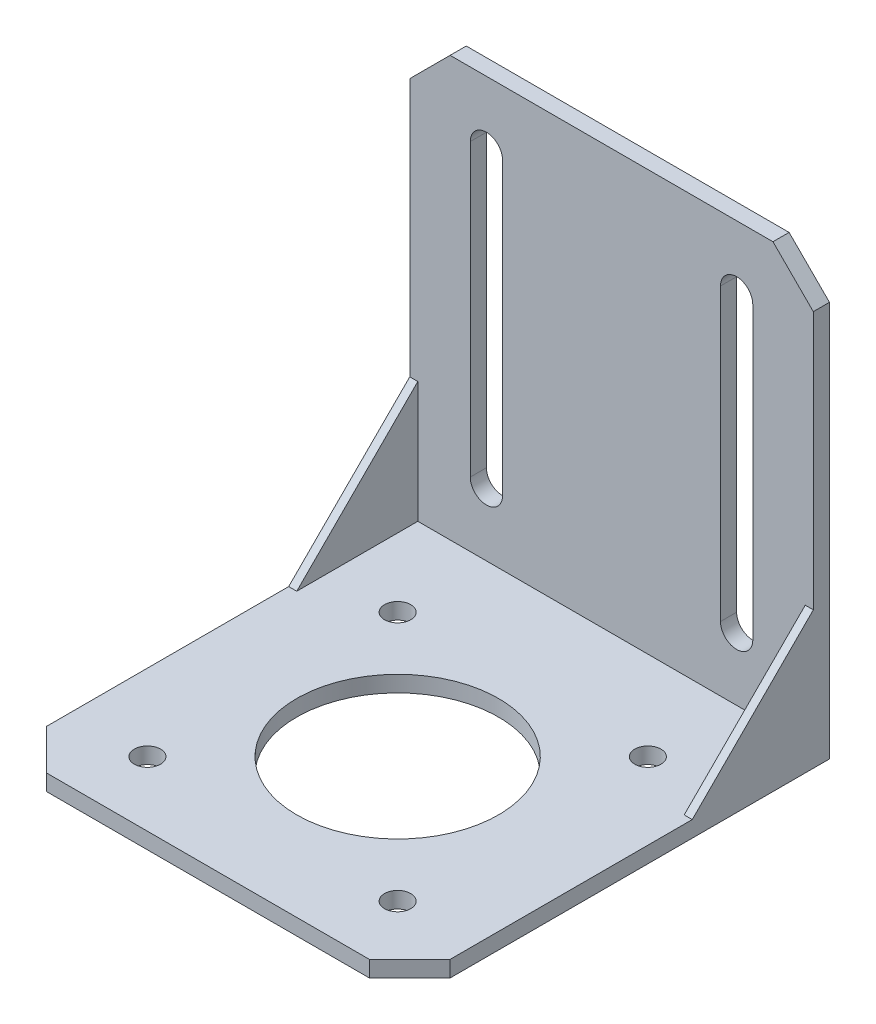
ISO-10303-21;
HEADER;
FILE_DESCRIPTION(('STEP AP214'),'2;1');
FILE_NAME('part.step','',(''),(''),'','','');
FILE_SCHEMA(('AUTOMOTIVE_DESIGN { 1 0 10303 214 1 1 1 1 }'));
ENDSEC;
DATA;
#1=APPLICATION_CONTEXT('core data for automotive mechanical design processes');
#2=APPLICATION_PROTOCOL_DEFINITION('international standard','automotive_design',2000,#1);
#3=PRODUCT_CONTEXT('',#1,'mechanical');
#4=PRODUCT('Part','Part','',(#3));
#5=PRODUCT_RELATED_PRODUCT_CATEGORY('part','',(#4));
#6=PRODUCT_DEFINITION_FORMATION('','',#4);
#7=PRODUCT_DEFINITION_CONTEXT('part definition',#1,'design');
#8=PRODUCT_DEFINITION('design','',#6,#7);
#9=PRODUCT_DEFINITION_SHAPE('','',#8);
#10=(LENGTH_UNIT() NAMED_UNIT(*) SI_UNIT(.MILLI.,.METRE.));
#11=(NAMED_UNIT(*) PLANE_ANGLE_UNIT() SI_UNIT($,.RADIAN.));
#12=(NAMED_UNIT(*) SI_UNIT($,.STERADIAN.) SOLID_ANGLE_UNIT());
#13=UNCERTAINTY_MEASURE_WITH_UNIT(LENGTH_MEASURE(1.E-05),#10,'distance_accuracy_value','');
#14=(GEOMETRIC_REPRESENTATION_CONTEXT(3) GLOBAL_UNCERTAINTY_ASSIGNED_CONTEXT((#13)) GLOBAL_UNIT_ASSIGNED_CONTEXT((#10,
#11,#12)) REPRESENTATION_CONTEXT('',''));
#15=CARTESIAN_POINT('',(0.,0.,0.));
#16=DIRECTION('',(0.,0.,1.));
#17=DIRECTION('',(1.,0.,0.));
#18=AXIS2_PLACEMENT_3D('',#15,#16,#17);
#19=CARTESIAN_POINT('',(-50.,0.,26.));
#20=DIRECTION('',(0.,0.,1.));
#21=DIRECTION('',(1.,0.,0.));
#22=AXIS2_PLACEMENT_3D('',#19,#20,#21);
#23=PLANE('',#22);
#24=DIRECTION('',(1.,0.,0.));
#25=VECTOR('',#24,1.);
#26=CARTESIAN_POINT('',(-50.,2.,26.));
#27=LINE('',#26,#25);
#28=CARTESIAN_POINT('',(-45.,2.,26.));
#29=VERTEX_POINT('',#28);
#30=CARTESIAN_POINT('',(-5.00000000000002,2.,26.));
#31=VERTEX_POINT('',#30);
#32=EDGE_CURVE('E330',#29,#31,#27,.T.);
#33=ORIENTED_EDGE('',*,*,#32,.F.);
#34=DIRECTION('',(0.,-1.,0.));
#35=VECTOR('',#34,1.);
#36=CARTESIAN_POINT('',(-45.,0.,26.));
#37=LINE('',#36,#35);
#38=CARTESIAN_POINT('',(-45.,0.,26.));
#39=VERTEX_POINT('',#38);
#40=EDGE_CURVE('E371',#29,#39,#37,.T.);
#41=ORIENTED_EDGE('',*,*,#40,.T.);
#42=DIRECTION('',(1.,0.,0.));
#43=VECTOR('',#42,1.);
#44=CARTESIAN_POINT('',(-50.,0.,26.));
#45=LINE('',#44,#43);
#46=CARTESIAN_POINT('',(-5.00000000000002,0.,26.));
#47=VERTEX_POINT('',#46);
#48=EDGE_CURVE('E322',#39,#47,#45,.T.);
#49=ORIENTED_EDGE('',*,*,#48,.T.);
#50=DIRECTION('',(0.,1.,0.));
#51=VECTOR('',#50,1.);
#52=CARTESIAN_POINT('',(-5.00000000000002,2.,26.));
#53=LINE('',#52,#51);
#54=EDGE_CURVE('E369',#47,#31,#53,.T.);
#55=ORIENTED_EDGE('',*,*,#54,.T.);
#56=EDGE_LOOP('',(#33,#41,#49,#55));
#57=FACE_BOUND('',#56,.T.);
#58=ADVANCED_FACE('F37',(#57),#23,.T.);
#59=CARTESIAN_POINT('',(-50.,2.,26.));
#60=DIRECTION('',(0.,1.,0.));
#61=DIRECTION('',(0.,0.,1.));
#62=AXIS2_PLACEMENT_3D('',#59,#60,#61);
#63=PLANE('',#62);
#64=DIRECTION('',(-1.,0.,0.));
#65=VECTOR('',#64,1.);
#66=CARTESIAN_POINT('',(-49.,2.,-9.));
#67=LINE('',#66,#65);
#68=CARTESIAN_POINT('',(-49.,2.,-9.));
#69=VERTEX_POINT('',#68);
#70=CARTESIAN_POINT('',(-50.,2.,-9.00000000000001));
#71=VERTEX_POINT('',#70);
#72=EDGE_CURVE('E210',#69,#71,#67,.T.);
#73=ORIENTED_EDGE('',*,*,#72,.T.);
#74=DIRECTION('',(0.,0.,1.));
#75=VECTOR('',#74,1.);
#76=CARTESIAN_POINT('',(-50.,2.,26.));
#77=LINE('',#76,#75);
#78=CARTESIAN_POINT('',(-50.,2.,21.));
#79=VERTEX_POINT('',#78);
#80=EDGE_CURVE('E320',#71,#79,#77,.T.);
#81=ORIENTED_EDGE('',*,*,#80,.T.);
#82=DIRECTION('',(-0.707106781186546,0.,-0.707106781186549));
#83=VECTOR('',#82,1.);
#84=CARTESIAN_POINT('',(-47.5,2.,23.5));
#85=LINE('',#84,#83);
#86=EDGE_CURVE('E11',#79,#29,#85,.F.);
#87=ORIENTED_EDGE('',*,*,#86,.T.);
#88=ORIENTED_EDGE('',*,*,#32,.T.);
#89=DIRECTION('',(0.707106781186549,0.,-0.707106781186547));
#90=VECTOR('',#89,1.);
#91=CARTESIAN_POINT('',(-27.5000000000001,2.,48.5));
#92=LINE('',#91,#90);
#93=CARTESIAN_POINT('',(0.,2.,21.));
#94=VERTEX_POINT('',#93);
#95=EDGE_CURVE('E46',#31,#94,#92,.T.);
#96=ORIENTED_EDGE('',*,*,#95,.T.);
#97=DIRECTION('',(0.,0.,1.));
#98=VECTOR('',#97,1.);
#99=CARTESIAN_POINT('',(0.,2.,26.));
#100=LINE('',#99,#98);
#101=CARTESIAN_POINT('',(0.,2.,-9.00000000000001));
#102=VERTEX_POINT('',#101);
#103=EDGE_CURVE('E315',#102,#94,#100,.T.);
#104=ORIENTED_EDGE('',*,*,#103,.F.);
#105=DIRECTION('',(1.,0.,0.));
#106=VECTOR('',#105,1.);
#107=CARTESIAN_POINT('',(-1.,2.,-9.));
#108=LINE('',#107,#106);
#109=CARTESIAN_POINT('',(-1.,2.,-9.));
#110=VERTEX_POINT('',#109);
#111=EDGE_CURVE('E196',#110,#102,#108,.T.);
#112=ORIENTED_EDGE('',*,*,#111,.F.);
#113=DIRECTION('',(0.,0.,-1.));
#114=VECTOR('',#113,1.);
#115=CARTESIAN_POINT('',(-1.,2.,-9.));
#116=LINE('',#115,#114);
#117=CARTESIAN_POINT('',(-1.,2.,-24.));
#118=VERTEX_POINT('',#117);
#119=EDGE_CURVE('E197',#110,#118,#116,.T.);
#120=ORIENTED_EDGE('',*,*,#119,.T.);
#121=DIRECTION('',(1.,0.,0.));
#122=VECTOR('',#121,1.);
#123=CARTESIAN_POINT('',(-50.,2.,-24.));
#124=LINE('',#123,#122);
#125=CARTESIAN_POINT('',(-49.,2.,-24.));
#126=VERTEX_POINT('',#125);
#127=EDGE_CURVE('E208',#126,#118,#124,.T.);
#128=ORIENTED_EDGE('',*,*,#127,.F.);
#129=DIRECTION('',(0.,0.,1.));
#130=VECTOR('',#129,1.);
#131=CARTESIAN_POINT('',(-49.,2.,0.));
#132=LINE('',#131,#130);
#133=EDGE_CURVE('E53',#126,#69,#132,.T.);
#134=ORIENTED_EDGE('',*,*,#133,.T.);
#135=EDGE_LOOP('',(#73,#81,#87,#88,#96,#104,#112,#120,#128,#134));
#136=FACE_BOUND('',#135,.T.);
#137=CARTESIAN_POINT('',(-25.,2.,2.5));
#138=DIRECTION('',(0.,1.,0.));
#139=DIRECTION('',(0.,0.,1.));
#140=AXIS2_PLACEMENT_3D('',#137,#138,#139);
#141=CIRCLE('',#140,12.5);
#142=CARTESIAN_POINT('',(-25.,2.,15.));
#143=VERTEX_POINT('',#142);
#144=EDGE_CURVE('E245',#143,#143,#141,.T.);
#145=ORIENTED_EDGE('',*,*,#144,.F.);
#146=EDGE_LOOP('',(#145));
#147=FACE_BOUND('',#146,.T.);
#148=CARTESIAN_POINT('',(-40.5,2.,18.));
#149=DIRECTION('',(0.,1.,0.));
#150=DIRECTION('',(0.,0.,-1.));
#151=AXIS2_PLACEMENT_3D('',#148,#149,#150);
#152=CIRCLE('',#151,1.625);
#153=CARTESIAN_POINT('',(-40.5,2.,16.375));
#154=VERTEX_POINT('',#153);
#155=EDGE_CURVE('E298',#154,#154,#152,.T.);
#156=ORIENTED_EDGE('',*,*,#155,.F.);
#157=EDGE_LOOP('',(#156));
#158=FACE_BOUND('',#157,.T.);
#159=CARTESIAN_POINT('',(-9.50000000000001,2.,18.));
#160=DIRECTION('',(0.,1.,0.));
#161=DIRECTION('',(0.,0.,1.));
#162=AXIS2_PLACEMENT_3D('',#159,#160,#161);
#163=CIRCLE('',#162,1.62500000000001);
#164=CARTESIAN_POINT('',(-9.50000000000001,2.,19.625));
#165=VERTEX_POINT('',#164);
#166=EDGE_CURVE('E292',#165,#165,#163,.T.);
#167=ORIENTED_EDGE('',*,*,#166,.F.);
#168=EDGE_LOOP('',(#167));
#169=FACE_BOUND('',#168,.T.);
#170=CARTESIAN_POINT('',(-9.50000000000001,2.,-13.));
#171=DIRECTION('',(0.,1.,0.));
#172=DIRECTION('',(0.,0.,-1.));
#173=AXIS2_PLACEMENT_3D('',#170,#171,#172);
#174=CIRCLE('',#173,1.62500000000001);
#175=CARTESIAN_POINT('',(-9.50000000000001,2.,-14.625));
#176=VERTEX_POINT('',#175);
#177=EDGE_CURVE('E286',#176,#176,#174,.T.);
#178=ORIENTED_EDGE('',*,*,#177,.F.);
#179=EDGE_LOOP('',(#178));
#180=FACE_BOUND('',#179,.T.);
#181=CARTESIAN_POINT('',(-40.5,2.,-13.));
#182=DIRECTION('',(0.,1.,0.));
#183=DIRECTION('',(0.,0.,1.));
#184=AXIS2_PLACEMENT_3D('',#181,#182,#183);
#185=CIRCLE('',#184,1.625);
#186=CARTESIAN_POINT('',(-40.5,2.,-11.375));
#187=VERTEX_POINT('',#186);
#188=EDGE_CURVE('E285',#187,#187,#185,.T.);
#189=ORIENTED_EDGE('',*,*,#188,.F.);
#190=EDGE_LOOP('',(#189));
#191=FACE_BOUND('',#190,.T.);
#192=ADVANCED_FACE('F381',(#136,#147,#158,#169,#180,#191),#63,.T.);
#193=CARTESIAN_POINT('',(-50.,2.,-24.));
#194=DIRECTION('',(0.,0.,1.));
#195=DIRECTION('',(1.,0.,0.));
#196=AXIS2_PLACEMENT_3D('',#193,#194,#195);
#197=PLANE('',#196);
#198=DIRECTION('',(-1.,0.,0.));
#199=VECTOR('',#198,1.);
#200=CARTESIAN_POINT('',(-49.,17.,-24.));
#201=LINE('',#200,#199);
#202=CARTESIAN_POINT('',(-49.,17.,-24.));
#203=VERTEX_POINT('',#202);
#204=CARTESIAN_POINT('',(-50.,17.,-24.));
#205=VERTEX_POINT('',#204);
#206=EDGE_CURVE('E61',#203,#205,#201,.T.);
#207=ORIENTED_EDGE('',*,*,#206,.F.);
#208=DIRECTION('',(0.,-1.,0.));
#209=VECTOR('',#208,1.);
#210=CARTESIAN_POINT('',(-49.,0.,-24.));
#211=LINE('',#210,#209);
#212=EDGE_CURVE('E423',#203,#126,#211,.T.);
#213=ORIENTED_EDGE('',*,*,#212,.T.);
#214=ORIENTED_EDGE('',*,*,#127,.T.);
#215=DIRECTION('',(0.,1.,0.));
#216=VECTOR('',#215,1.);
#217=CARTESIAN_POINT('',(-1.,2.,-24.));
#218=LINE('',#217,#216);
#219=CARTESIAN_POINT('',(-1.,17.,-24.));
#220=VERTEX_POINT('',#219);
#221=EDGE_CURVE('E202',#118,#220,#218,.T.);
#222=ORIENTED_EDGE('',*,*,#221,.T.);
#223=DIRECTION('',(1.,0.,0.));
#224=VECTOR('',#223,1.);
#225=CARTESIAN_POINT('',(-1.,17.,-24.));
#226=LINE('',#225,#224);
#227=CARTESIAN_POINT('',(0.,17.,-24.));
#228=VERTEX_POINT('',#227);
#229=EDGE_CURVE('E186',#220,#228,#226,.T.);
#230=ORIENTED_EDGE('',*,*,#229,.T.);
#231=DIRECTION('',(0.,-1.,0.));
#232=VECTOR('',#231,1.);
#233=CARTESIAN_POINT('',(0.,2.,-24.));
#234=LINE('',#233,#232);
#235=CARTESIAN_POINT('',(0.,49.,-24.));
#236=VERTEX_POINT('',#235);
#237=EDGE_CURVE('E327',#236,#228,#234,.T.);
#238=ORIENTED_EDGE('',*,*,#237,.F.);
#239=DIRECTION('',(-0.707106781186549,0.707106781186545,0.));
#240=VECTOR('',#239,1.);
#241=CARTESIAN_POINT('',(-1.50000000000014,50.5000000000001,-24.));
#242=LINE('',#241,#240);
#243=CARTESIAN_POINT('',(-5.00000000000002,54.,-24.));
#244=VERTEX_POINT('',#243);
#245=EDGE_CURVE('E350',#236,#244,#242,.T.);
#246=ORIENTED_EDGE('',*,*,#245,.T.);
#247=DIRECTION('',(1.,0.,0.));
#248=VECTOR('',#247,1.);
#249=CARTESIAN_POINT('',(-50.,54.,-24.));
#250=LINE('',#249,#248);
#251=CARTESIAN_POINT('',(-45.,54.,-24.));
#252=VERTEX_POINT('',#251);
#253=EDGE_CURVE('E335',#252,#244,#250,.T.);
#254=ORIENTED_EDGE('',*,*,#253,.F.);
#255=DIRECTION('',(0.707106781186546,0.70710678118655,0.));
#256=VECTOR('',#255,1.);
#257=CARTESIAN_POINT('',(-73.5,25.4999999999999,-24.));
#258=LINE('',#257,#256);
#259=CARTESIAN_POINT('',(-50.,49.,-24.));
#260=VERTEX_POINT('',#259);
#261=EDGE_CURVE('E352',#252,#260,#258,.F.);
#262=ORIENTED_EDGE('',*,*,#261,.T.);
#263=DIRECTION('',(0.,-1.,0.));
#264=VECTOR('',#263,1.);
#265=CARTESIAN_POINT('',(-50.,2.,-24.));
#266=LINE('',#265,#264);
#267=EDGE_CURVE('E318',#260,#205,#266,.T.);
#268=ORIENTED_EDGE('',*,*,#267,.T.);
#269=EDGE_LOOP('',(#207,#213,#214,#222,#230,#238,#246,#254,#262,#268));
#270=FACE_BOUND('',#269,.T.);
#271=CARTESIAN_POINT('',(-40.5,46.,-24.));
#272=DIRECTION('',(0.,0.,1.));
#273=DIRECTION('',(1.,0.,0.));
#274=AXIS2_PLACEMENT_3D('',#271,#272,#273);
#275=CIRCLE('',#274,2.00000000000001);
#276=CARTESIAN_POINT('',(-38.5,46.,-24.));
#277=VERTEX_POINT('',#276);
#278=CARTESIAN_POINT('',(-42.5,46.,-24.));
#279=VERTEX_POINT('',#278);
#280=EDGE_CURVE('E232',#277,#279,#275,.T.);
#281=ORIENTED_EDGE('',*,*,#280,.F.);
#282=DIRECTION('',(0.,1.,0.));
#283=VECTOR('',#282,1.);
#284=CARTESIAN_POINT('',(-38.5,46.,-24.));
#285=LINE('',#284,#283);
#286=CARTESIAN_POINT('',(-38.5,10.,-24.));
#287=VERTEX_POINT('',#286);
#288=EDGE_CURVE('E222',#287,#277,#285,.T.);
#289=ORIENTED_EDGE('',*,*,#288,.F.);
#290=CARTESIAN_POINT('',(-40.5,10.,-24.));
#291=DIRECTION('',(0.,0.,1.));
#292=DIRECTION('',(1.,0.,0.));
#293=AXIS2_PLACEMENT_3D('',#290,#291,#292);
#294=CIRCLE('',#293,2.00000000000001);
#295=CARTESIAN_POINT('',(-42.5,10.,-24.));
#296=VERTEX_POINT('',#295);
#297=EDGE_CURVE('E238',#296,#287,#294,.T.);
#298=ORIENTED_EDGE('',*,*,#297,.F.);
#299=DIRECTION('',(0.,-1.,0.));
#300=VECTOR('',#299,1.);
#301=CARTESIAN_POINT('',(-42.5,46.,-24.));
#302=LINE('',#301,#300);
#303=EDGE_CURVE('E234',#279,#296,#302,.T.);
#304=ORIENTED_EDGE('',*,*,#303,.F.);
#305=EDGE_LOOP('',(#281,#289,#298,#304));
#306=FACE_BOUND('',#305,.T.);
#307=CARTESIAN_POINT('',(-9.5,46.,-24.));
#308=DIRECTION('',(0.,0.,1.));
#309=DIRECTION('',(-1.,0.,0.));
#310=AXIS2_PLACEMENT_3D('',#307,#308,#309);
#311=CIRCLE('',#310,2.);
#312=CARTESIAN_POINT('',(-7.5,46.,-24.));
#313=VERTEX_POINT('',#312);
#314=CARTESIAN_POINT('',(-11.5,46.,-24.));
#315=VERTEX_POINT('',#314);
#316=EDGE_CURVE('E216',#313,#315,#311,.T.);
#317=ORIENTED_EDGE('',*,*,#316,.F.);
#318=DIRECTION('',(0.,1.,0.));
#319=VECTOR('',#318,1.);
#320=CARTESIAN_POINT('',(-7.5,46.,-24.));
#321=LINE('',#320,#319);
#322=CARTESIAN_POINT('',(-7.5,10.,-24.));
#323=VERTEX_POINT('',#322);
#324=EDGE_CURVE('E256',#323,#313,#321,.T.);
#325=ORIENTED_EDGE('',*,*,#324,.F.);
#326=CARTESIAN_POINT('',(-9.50000000000001,10.,-24.));
#327=DIRECTION('',(0.,0.,1.));
#328=DIRECTION('',(-1.,0.,0.));
#329=AXIS2_PLACEMENT_3D('',#326,#327,#328);
#330=CIRCLE('',#329,2.00000000000001);
#331=CARTESIAN_POINT('',(-11.5,10.,-24.));
#332=VERTEX_POINT('',#331);
#333=EDGE_CURVE('E270',#332,#323,#330,.T.);
#334=ORIENTED_EDGE('',*,*,#333,.F.);
#335=DIRECTION('',(0.,-1.,0.));
#336=VECTOR('',#335,1.);
#337=CARTESIAN_POINT('',(-11.5,46.,-24.));
#338=LINE('',#337,#336);
#339=EDGE_CURVE('E267',#315,#332,#338,.T.);
#340=ORIENTED_EDGE('',*,*,#339,.F.);
#341=EDGE_LOOP('',(#317,#325,#334,#340));
#342=FACE_BOUND('',#341,.T.);
#343=ADVANCED_FACE('F206',(#270,#306,#342),#197,.T.);
#344=CARTESIAN_POINT('',(-50.,54.,-26.));
#345=DIRECTION('',(0.,1.,0.));
#346=DIRECTION('',(0.,0.,1.));
#347=AXIS2_PLACEMENT_3D('',#344,#345,#346);
#348=PLANE('',#347);
#349=DIRECTION('',(1.,0.,0.));
#350=VECTOR('',#349,1.);
#351=CARTESIAN_POINT('',(-50.,54.,-26.));
#352=LINE('',#351,#350);
#353=CARTESIAN_POINT('',(-45.,54.,-26.));
#354=VERTEX_POINT('',#353);
#355=CARTESIAN_POINT('',(-5.00000000000002,54.,-26.));
#356=VERTEX_POINT('',#355);
#357=EDGE_CURVE('E338',#354,#356,#352,.T.);
#358=ORIENTED_EDGE('',*,*,#357,.F.);
#359=DIRECTION('',(0.,0.,1.));
#360=VECTOR('',#359,1.);
#361=CARTESIAN_POINT('',(-45.,54.,-26.));
#362=LINE('',#361,#360);
#363=EDGE_CURVE('E347',#354,#252,#362,.T.);
#364=ORIENTED_EDGE('',*,*,#363,.T.);
#365=ORIENTED_EDGE('',*,*,#253,.T.);
#366=DIRECTION('',(0.,0.,-1.));
#367=VECTOR('',#366,1.);
#368=CARTESIAN_POINT('',(-5.00000000000002,54.,-26.));
#369=LINE('',#368,#367);
#370=EDGE_CURVE('E333',#244,#356,#369,.T.);
#371=ORIENTED_EDGE('',*,*,#370,.T.);
#372=EDGE_LOOP('',(#358,#364,#365,#371));
#373=FACE_BOUND('',#372,.T.);
#374=ADVANCED_FACE('F406',(#373),#348,.T.);
#375=CARTESIAN_POINT('',(-50.,0.,-26.));
#376=DIRECTION('',(0.,0.,-1.));
#377=DIRECTION('',(0.,1.,0.));
#378=AXIS2_PLACEMENT_3D('',#375,#376,#377);
#379=PLANE('',#378);
#380=CARTESIAN_POINT('',(-40.5,46.,-26.));
#381=DIRECTION('',(0.,0.,1.));
#382=DIRECTION('',(1.,0.,0.));
#383=AXIS2_PLACEMENT_3D('',#380,#381,#382);
#384=CIRCLE('',#383,2.00000000000001);
#385=CARTESIAN_POINT('',(-38.5,46.,-26.));
#386=VERTEX_POINT('',#385);
#387=CARTESIAN_POINT('',(-42.5,46.,-26.));
#388=VERTEX_POINT('',#387);
#389=EDGE_CURVE('E218',#386,#388,#384,.T.);
#390=ORIENTED_EDGE('',*,*,#389,.T.);
#391=DIRECTION('',(0.,-1.,0.));
#392=VECTOR('',#391,1.);
#393=CARTESIAN_POINT('',(-42.5,46.,-26.));
#394=LINE('',#393,#392);
#395=CARTESIAN_POINT('',(-42.5,10.,-26.));
#396=VERTEX_POINT('',#395);
#397=EDGE_CURVE('E221',#388,#396,#394,.T.);
#398=ORIENTED_EDGE('',*,*,#397,.T.);
#399=CARTESIAN_POINT('',(-40.5,10.,-26.));
#400=DIRECTION('',(0.,0.,1.));
#401=DIRECTION('',(1.,0.,0.));
#402=AXIS2_PLACEMENT_3D('',#399,#400,#401);
#403=CIRCLE('',#402,2.00000000000001);
#404=CARTESIAN_POINT('',(-38.5,10.,-26.));
#405=VERTEX_POINT('',#404);
#406=EDGE_CURVE('E225',#396,#405,#403,.T.);
#407=ORIENTED_EDGE('',*,*,#406,.T.);
#408=DIRECTION('',(0.,1.,0.));
#409=VECTOR('',#408,1.);
#410=CARTESIAN_POINT('',(-38.5,46.,-26.));
#411=LINE('',#410,#409);
#412=EDGE_CURVE('E228',#405,#386,#411,.T.);
#413=ORIENTED_EDGE('',*,*,#412,.T.);
#414=EDGE_LOOP('',(#390,#398,#407,#413));
#415=FACE_BOUND('',#414,.T.);
#416=CARTESIAN_POINT('',(-9.5,46.,-26.));
#417=DIRECTION('',(0.,0.,1.));
#418=DIRECTION('',(-1.,0.,0.));
#419=AXIS2_PLACEMENT_3D('',#416,#417,#418);
#420=CIRCLE('',#419,2.);
#421=CARTESIAN_POINT('',(-7.5,46.,-26.));
#422=VERTEX_POINT('',#421);
#423=CARTESIAN_POINT('',(-11.5,46.,-26.));
#424=VERTEX_POINT('',#423);
#425=EDGE_CURVE('E252',#422,#424,#420,.T.);
#426=ORIENTED_EDGE('',*,*,#425,.T.);
#427=DIRECTION('',(0.,-1.,0.));
#428=VECTOR('',#427,1.);
#429=CARTESIAN_POINT('',(-11.5,46.,-26.));
#430=LINE('',#429,#428);
#431=CARTESIAN_POINT('',(-11.5,10.,-26.));
#432=VERTEX_POINT('',#431);
#433=EDGE_CURVE('E255',#424,#432,#430,.T.);
#434=ORIENTED_EDGE('',*,*,#433,.T.);
#435=CARTESIAN_POINT('',(-9.50000000000001,10.,-26.));
#436=DIRECTION('',(0.,0.,1.));
#437=DIRECTION('',(-1.,0.,0.));
#438=AXIS2_PLACEMENT_3D('',#435,#436,#437);
#439=CIRCLE('',#438,2.00000000000001);
#440=CARTESIAN_POINT('',(-7.5,10.,-26.));
#441=VERTEX_POINT('',#440);
#442=EDGE_CURVE('E259',#432,#441,#439,.T.);
#443=ORIENTED_EDGE('',*,*,#442,.T.);
#444=DIRECTION('',(0.,1.,0.));
#445=VECTOR('',#444,1.);
#446=CARTESIAN_POINT('',(-7.5,46.,-26.));
#447=LINE('',#446,#445);
#448=EDGE_CURVE('E262',#441,#422,#447,.T.);
#449=ORIENTED_EDGE('',*,*,#448,.T.);
#450=EDGE_LOOP('',(#426,#434,#443,#449));
#451=FACE_BOUND('',#450,.T.);
#452=DIRECTION('',(0.,1.,0.));
#453=VECTOR('',#452,1.);
#454=CARTESIAN_POINT('',(-50.,0.,-26.));
#455=LINE('',#454,#453);
#456=CARTESIAN_POINT('',(-50.,0.,-26.));
#457=VERTEX_POINT('',#456);
#458=CARTESIAN_POINT('',(-50.,49.,-26.));
#459=VERTEX_POINT('',#458);
#460=EDGE_CURVE('E314',#457,#459,#455,.T.);
#461=ORIENTED_EDGE('',*,*,#460,.T.);
#462=DIRECTION('',(-0.707106781186546,-0.707106781186549,0.));
#463=VECTOR('',#462,1.);
#464=CARTESIAN_POINT('',(-74.5,24.4999999999998,-26.));
#465=LINE('',#464,#463);
#466=EDGE_CURVE('E361',#459,#354,#465,.F.);
#467=ORIENTED_EDGE('',*,*,#466,.T.);
#468=ORIENTED_EDGE('',*,*,#357,.T.);
#469=DIRECTION('',(0.70710678118655,-0.707106781186546,0.));
#470=VECTOR('',#469,1.);
#471=CARTESIAN_POINT('',(-0.500000000000139,49.5000000000001,-26.));
#472=LINE('',#471,#470);
#473=CARTESIAN_POINT('',(0.,49.,-26.));
#474=VERTEX_POINT('',#473);
#475=EDGE_CURVE('E359',#356,#474,#472,.T.);
#476=ORIENTED_EDGE('',*,*,#475,.T.);
#477=DIRECTION('',(0.,1.,0.));
#478=VECTOR('',#477,1.);
#479=CARTESIAN_POINT('',(0.,0.,-26.));
#480=LINE('',#479,#478);
#481=CARTESIAN_POINT('',(0.,0.,-26.));
#482=VERTEX_POINT('',#481);
#483=EDGE_CURVE('E324',#482,#474,#480,.T.);
#484=ORIENTED_EDGE('',*,*,#483,.F.);
#485=DIRECTION('',(1.,0.,0.));
#486=VECTOR('',#485,1.);
#487=CARTESIAN_POINT('',(-50.,0.,-26.));
#488=LINE('',#487,#486);
#489=EDGE_CURVE('E341',#457,#482,#488,.T.);
#490=ORIENTED_EDGE('',*,*,#489,.F.);
#491=EDGE_LOOP('',(#461,#467,#468,#476,#484,#490));
#492=FACE_BOUND('',#491,.T.);
#493=ADVANCED_FACE('F397',(#415,#451,#492),#379,.T.);
#494=CARTESIAN_POINT('',(-50.,0.,26.));
#495=DIRECTION('',(0.,-1.,0.));
#496=DIRECTION('',(0.,0.,-1.));
#497=AXIS2_PLACEMENT_3D('',#494,#495,#496);
#498=PLANE('',#497);
#499=CARTESIAN_POINT('',(-25.,0.,2.5));
#500=DIRECTION('',(0.,1.,0.));
#501=DIRECTION('',(0.,0.,1.));
#502=AXIS2_PLACEMENT_3D('',#499,#500,#501);
#503=CIRCLE('',#502,12.5);
#504=CARTESIAN_POINT('',(-25.,0.,15.));
#505=VERTEX_POINT('',#504);
#506=EDGE_CURVE('E301',#505,#505,#503,.T.);
#507=ORIENTED_EDGE('',*,*,#506,.T.);
#508=EDGE_LOOP('',(#507));
#509=FACE_BOUND('',#508,.T.);
#510=CARTESIAN_POINT('',(-40.5,0.,18.));
#511=DIRECTION('',(0.,1.,0.));
#512=DIRECTION('',(0.,0.,-1.));
#513=AXIS2_PLACEMENT_3D('',#510,#511,#512);
#514=CIRCLE('',#513,1.625);
#515=CARTESIAN_POINT('',(-40.5,0.,16.375));
#516=VERTEX_POINT('',#515);
#517=EDGE_CURVE('E295',#516,#516,#514,.T.);
#518=ORIENTED_EDGE('',*,*,#517,.T.);
#519=EDGE_LOOP('',(#518));
#520=FACE_BOUND('',#519,.T.);
#521=CARTESIAN_POINT('',(-9.50000000000001,0.,18.));
#522=DIRECTION('',(0.,1.,0.));
#523=DIRECTION('',(0.,0.,1.));
#524=AXIS2_PLACEMENT_3D('',#521,#522,#523);
#525=CIRCLE('',#524,1.62500000000001);
#526=CARTESIAN_POINT('',(-9.50000000000001,0.,19.625));
#527=VERTEX_POINT('',#526);
#528=EDGE_CURVE('E289',#527,#527,#525,.T.);
#529=ORIENTED_EDGE('',*,*,#528,.T.);
#530=EDGE_LOOP('',(#529));
#531=FACE_BOUND('',#530,.T.);
#532=CARTESIAN_POINT('',(-9.50000000000001,0.,-13.));
#533=DIRECTION('',(0.,1.,0.));
#534=DIRECTION('',(0.,0.,-1.));
#535=AXIS2_PLACEMENT_3D('',#532,#533,#534);
#536=CIRCLE('',#535,1.62500000000001);
#537=CARTESIAN_POINT('',(-9.50000000000001,0.,-14.625));
#538=VERTEX_POINT('',#537);
#539=EDGE_CURVE('E282',#538,#538,#536,.T.);
#540=ORIENTED_EDGE('',*,*,#539,.T.);
#541=EDGE_LOOP('',(#540));
#542=FACE_BOUND('',#541,.T.);
#543=CARTESIAN_POINT('',(-40.5,0.,-13.));
#544=DIRECTION('',(0.,1.,0.));
#545=DIRECTION('',(0.,0.,1.));
#546=AXIS2_PLACEMENT_3D('',#543,#544,#545);
#547=CIRCLE('',#546,1.625);
#548=CARTESIAN_POINT('',(-40.5,0.,-11.375));
#549=VERTEX_POINT('',#548);
#550=EDGE_CURVE('E306',#549,#549,#547,.T.);
#551=ORIENTED_EDGE('',*,*,#550,.T.);
#552=EDGE_LOOP('',(#551));
#553=FACE_BOUND('',#552,.T.);
#554=ORIENTED_EDGE('',*,*,#48,.F.);
#555=DIRECTION('',(0.707106781186546,0.,0.70710678118655));
#556=VECTOR('',#555,1.);
#557=CARTESIAN_POINT('',(-47.5,0.,23.5));
#558=LINE('',#557,#556);
#559=CARTESIAN_POINT('',(-50.,0.,21.));
#560=VERTEX_POINT('',#559);
#561=EDGE_CURVE('E376',#39,#560,#558,.F.);
#562=ORIENTED_EDGE('',*,*,#561,.T.);
#563=DIRECTION('',(0.,0.,-1.));
#564=VECTOR('',#563,1.);
#565=CARTESIAN_POINT('',(-50.,0.,26.));
#566=LINE('',#565,#564);
#567=EDGE_CURVE('E312',#560,#457,#566,.T.);
#568=ORIENTED_EDGE('',*,*,#567,.T.);
#569=ORIENTED_EDGE('',*,*,#489,.T.);
#570=DIRECTION('',(0.,0.,-1.));
#571=VECTOR('',#570,1.);
#572=CARTESIAN_POINT('',(0.,0.,26.));
#573=LINE('',#572,#571);
#574=CARTESIAN_POINT('',(0.,0.,21.));
#575=VERTEX_POINT('',#574);
#576=EDGE_CURVE('E309',#575,#482,#573,.T.);
#577=ORIENTED_EDGE('',*,*,#576,.F.);
#578=DIRECTION('',(-0.707106781186549,0.,0.707106781186547));
#579=VECTOR('',#578,1.);
#580=CARTESIAN_POINT('',(-27.5000000000001,0.,48.5));
#581=LINE('',#580,#579);
#582=EDGE_CURVE('E374',#575,#47,#581,.T.);
#583=ORIENTED_EDGE('',*,*,#582,.T.);
#584=EDGE_LOOP('',(#554,#562,#568,#569,#577,#583));
#585=FACE_BOUND('',#584,.T.);
#586=ADVANCED_FACE('F391',(#509,#520,#531,#542,#553,#585),#498,.T.);
#587=CARTESIAN_POINT('',(-50.,0.,0.));
#588=DIRECTION('',(-1.,0.,0.));
#589=DIRECTION('',(0.,0.,1.));
#590=AXIS2_PLACEMENT_3D('',#587,#588,#589);
#591=PLANE('',#590);
#592=ORIENTED_EDGE('',*,*,#80,.F.);
#593=DIRECTION('',(0.,0.707106781186548,-0.707106781186547));
#594=VECTOR('',#593,1.);
#595=CARTESIAN_POINT('',(-50.,-3.5,-3.5));
#596=LINE('',#595,#594);
#597=EDGE_CURVE('E418',#71,#205,#596,.T.);
#598=ORIENTED_EDGE('',*,*,#597,.T.);
#599=ORIENTED_EDGE('',*,*,#267,.F.);
#600=DIRECTION('',(0.,0.,-1.));
#601=VECTOR('',#600,1.);
#602=CARTESIAN_POINT('',(-50.,49.,0.));
#603=LINE('',#602,#601);
#604=EDGE_CURVE('E357',#260,#459,#603,.T.);
#605=ORIENTED_EDGE('',*,*,#604,.T.);
#606=ORIENTED_EDGE('',*,*,#460,.F.);
#607=ORIENTED_EDGE('',*,*,#567,.F.);
#608=DIRECTION('',(0.,1.,0.));
#609=VECTOR('',#608,1.);
#610=CARTESIAN_POINT('',(-50.,0.,21.));
#611=LINE('',#610,#609);
#612=EDGE_CURVE('E354',#560,#79,#611,.T.);
#613=ORIENTED_EDGE('',*,*,#612,.T.);
#614=EDGE_LOOP('',(#592,#598,#599,#605,#606,#607,#613));
#615=FACE_BOUND('',#614,.T.);
#616=ADVANCED_FACE('F416',(#615),#591,.T.);
#617=CARTESIAN_POINT('',(0.,0.,0.));
#618=DIRECTION('',(-1.,0.,0.));
#619=DIRECTION('',(0.,0.,1.));
#620=AXIS2_PLACEMENT_3D('',#617,#618,#619);
#621=PLANE('',#620);
#622=ORIENTED_EDGE('',*,*,#237,.T.);
#623=DIRECTION('',(0.,-0.707106781186548,0.707106781186547));
#624=VECTOR('',#623,1.);
#625=CARTESIAN_POINT('',(0.,17.,-24.));
#626=LINE('',#625,#624);
#627=EDGE_CURVE('E192',#228,#102,#626,.T.);
#628=ORIENTED_EDGE('',*,*,#627,.T.);
#629=ORIENTED_EDGE('',*,*,#103,.T.);
#630=DIRECTION('',(0.,-1.,0.));
#631=VECTOR('',#630,1.);
#632=CARTESIAN_POINT('',(0.,0.,21.));
#633=LINE('',#632,#631);
#634=EDGE_CURVE('E363',#94,#575,#633,.T.);
#635=ORIENTED_EDGE('',*,*,#634,.T.);
#636=ORIENTED_EDGE('',*,*,#576,.T.);
#637=ORIENTED_EDGE('',*,*,#483,.T.);
#638=DIRECTION('',(0.,0.,1.));
#639=VECTOR('',#638,1.);
#640=CARTESIAN_POINT('',(0.,49.,-24.));
#641=LINE('',#640,#639);
#642=EDGE_CURVE('E366',#474,#236,#641,.T.);
#643=ORIENTED_EDGE('',*,*,#642,.T.);
#644=EDGE_LOOP('',(#622,#628,#629,#635,#636,#637,#643));
#645=FACE_BOUND('',#644,.T.);
#646=ADVANCED_FACE('F388',(#645),#621,.F.);
#647=CARTESIAN_POINT('',(-45.,54.,-26.));
#648=DIRECTION('',(0.707106781186549,-0.707106781186545,0.));
#649=DIRECTION('',(0.,0.,1.));
#650=AXIS2_PLACEMENT_3D('',#647,#648,#649);
#651=PLANE('',#650);
#652=ORIENTED_EDGE('',*,*,#466,.F.);
#653=ORIENTED_EDGE('',*,*,#604,.F.);
#654=ORIENTED_EDGE('',*,*,#261,.F.);
#655=ORIENTED_EDGE('',*,*,#363,.F.);
#656=EDGE_LOOP('',(#652,#653,#654,#655));
#657=FACE_BOUND('',#656,.T.);
#658=ADVANCED_FACE('F410',(#657),#651,.F.);
#659=CARTESIAN_POINT('',(0.,49.,0.));
#660=DIRECTION('',(0.707106781186545,0.707106781186549,0.));
#661=DIRECTION('',(0.,0.,-1.));
#662=AXIS2_PLACEMENT_3D('',#659,#660,#661);
#663=PLANE('',#662);
#664=ORIENTED_EDGE('',*,*,#475,.F.);
#665=ORIENTED_EDGE('',*,*,#370,.F.);
#666=ORIENTED_EDGE('',*,*,#245,.F.);
#667=ORIENTED_EDGE('',*,*,#642,.F.);
#668=EDGE_LOOP('',(#664,#665,#666,#667));
#669=FACE_BOUND('',#668,.T.);
#670=ADVANCED_FACE('F401',(#669),#663,.T.);
#671=CARTESIAN_POINT('',(-45.,0.,26.));
#672=DIRECTION('',(0.707106781186549,0.,-0.707106781186545));
#673=DIRECTION('',(0.,-1.,0.));
#674=AXIS2_PLACEMENT_3D('',#671,#672,#673);
#675=PLANE('',#674);
#676=ORIENTED_EDGE('',*,*,#86,.F.);
#677=ORIENTED_EDGE('',*,*,#612,.F.);
#678=ORIENTED_EDGE('',*,*,#561,.F.);
#679=ORIENTED_EDGE('',*,*,#40,.F.);
#680=EDGE_LOOP('',(#676,#677,#678,#679));
#681=FACE_BOUND('',#680,.T.);
#682=ADVANCED_FACE('F459',(#681),#675,.F.);
#683=CARTESIAN_POINT('',(0.,0.,21.));
#684=DIRECTION('',(0.707106781186547,0.,0.707106781186549));
#685=DIRECTION('',(0.,1.,0.));
#686=AXIS2_PLACEMENT_3D('',#683,#684,#685);
#687=PLANE('',#686);
#688=ORIENTED_EDGE('',*,*,#95,.F.);
#689=ORIENTED_EDGE('',*,*,#54,.F.);
#690=ORIENTED_EDGE('',*,*,#582,.F.);
#691=ORIENTED_EDGE('',*,*,#634,.F.);
#692=EDGE_LOOP('',(#688,#689,#690,#691));
#693=FACE_BOUND('',#692,.T.);
#694=ADVANCED_FACE('F40',(#693),#687,.T.);
#695=CARTESIAN_POINT('',(-40.5,0.,-13.));
#696=DIRECTION('',(0.,1.,0.));
#697=DIRECTION('',(0.,0.,1.));
#698=AXIS2_PLACEMENT_3D('',#695,#696,#697);
#699=CYLINDRICAL_SURFACE('',#698,1.625);
#700=ORIENTED_EDGE('',*,*,#550,.F.);
#701=EDGE_LOOP('',(#700));
#702=FACE_BOUND('',#701,.T.);
#703=ORIENTED_EDGE('',*,*,#188,.T.);
#704=EDGE_LOOP('',(#703));
#705=FACE_BOUND('',#704,.T.);
#706=ADVANCED_FACE('F467',(#702,#705),#699,.F.);
#707=CARTESIAN_POINT('',(-9.50000000000001,0.,-13.));
#708=DIRECTION('',(0.,1.,0.));
#709=DIRECTION('',(0.,0.,1.));
#710=AXIS2_PLACEMENT_3D('',#707,#708,#709);
#711=CYLINDRICAL_SURFACE('',#710,1.62500000000001);
#712=ORIENTED_EDGE('',*,*,#539,.F.);
#713=EDGE_LOOP('',(#712));
#714=FACE_BOUND('',#713,.T.);
#715=ORIENTED_EDGE('',*,*,#177,.T.);
#716=EDGE_LOOP('',(#715));
#717=FACE_BOUND('',#716,.T.);
#718=ADVANCED_FACE('F474',(#714,#717),#711,.F.);
#719=CARTESIAN_POINT('',(-9.50000000000001,0.,18.));
#720=DIRECTION('',(0.,1.,0.));
#721=DIRECTION('',(0.,0.,1.));
#722=AXIS2_PLACEMENT_3D('',#719,#720,#721);
#723=CYLINDRICAL_SURFACE('',#722,1.62500000000001);
#724=ORIENTED_EDGE('',*,*,#528,.F.);
#725=EDGE_LOOP('',(#724));
#726=FACE_BOUND('',#725,.T.);
#727=ORIENTED_EDGE('',*,*,#166,.T.);
#728=EDGE_LOOP('',(#727));
#729=FACE_BOUND('',#728,.T.);
#730=ADVANCED_FACE('F480',(#726,#729),#723,.F.);
#731=CARTESIAN_POINT('',(-40.5,0.,18.));
#732=DIRECTION('',(0.,1.,0.));
#733=DIRECTION('',(0.,0.,1.));
#734=AXIS2_PLACEMENT_3D('',#731,#732,#733);
#735=CYLINDRICAL_SURFACE('',#734,1.625);
#736=ORIENTED_EDGE('',*,*,#517,.F.);
#737=EDGE_LOOP('',(#736));
#738=FACE_BOUND('',#737,.T.);
#739=ORIENTED_EDGE('',*,*,#155,.T.);
#740=EDGE_LOOP('',(#739));
#741=FACE_BOUND('',#740,.T.);
#742=ADVANCED_FACE('F536',(#738,#741),#735,.F.);
#743=CARTESIAN_POINT('',(-25.,0.,2.5));
#744=DIRECTION('',(0.,1.,0.));
#745=DIRECTION('',(0.,0.,1.));
#746=AXIS2_PLACEMENT_3D('',#743,#744,#745);
#747=CYLINDRICAL_SURFACE('',#746,12.5);
#748=ORIENTED_EDGE('',*,*,#506,.F.);
#749=EDGE_LOOP('',(#748));
#750=FACE_BOUND('',#749,.T.);
#751=ORIENTED_EDGE('',*,*,#144,.T.);
#752=EDGE_LOOP('',(#751));
#753=FACE_BOUND('',#752,.T.);
#754=ADVANCED_FACE('F487',(#750,#753),#747,.F.);
#755=CARTESIAN_POINT('',(-9.5,46.,-26.));
#756=DIRECTION('',(0.,0.,1.));
#757=DIRECTION('',(1.,0.,0.));
#758=AXIS2_PLACEMENT_3D('',#755,#756,#757);
#759=CYLINDRICAL_SURFACE('',#758,2.);
#760=ORIENTED_EDGE('',*,*,#316,.T.);
#761=DIRECTION('',(0.,0.,1.));
#762=VECTOR('',#761,1.);
#763=CARTESIAN_POINT('',(-11.5,46.,-26.));
#764=LINE('',#763,#762);
#765=EDGE_CURVE('E265',#424,#315,#764,.T.);
#766=ORIENTED_EDGE('',*,*,#765,.F.);
#767=ORIENTED_EDGE('',*,*,#425,.F.);
#768=DIRECTION('',(0.,0.,1.));
#769=VECTOR('',#768,1.);
#770=CARTESIAN_POINT('',(-7.5,46.,-26.));
#771=LINE('',#770,#769);
#772=EDGE_CURVE('E235',#422,#313,#771,.T.);
#773=ORIENTED_EDGE('',*,*,#772,.T.);
#774=EDGE_LOOP('',(#760,#766,#767,#773));
#775=FACE_BOUND('',#774,.T.);
#776=ADVANCED_FACE('F508',(#775),#759,.F.);
#777=CARTESIAN_POINT('',(-7.5,46.,-26.));
#778=DIRECTION('',(1.,0.,0.));
#779=DIRECTION('',(0.,1.,0.));
#780=AXIS2_PLACEMENT_3D('',#777,#778,#779);
#781=PLANE('',#780);
#782=ORIENTED_EDGE('',*,*,#324,.T.);
#783=ORIENTED_EDGE('',*,*,#772,.F.);
#784=ORIENTED_EDGE('',*,*,#448,.F.);
#785=DIRECTION('',(0.,0.,1.));
#786=VECTOR('',#785,1.);
#787=CARTESIAN_POINT('',(-7.5,10.,-26.));
#788=LINE('',#787,#786);
#789=EDGE_CURVE('E276',#441,#323,#788,.T.);
#790=ORIENTED_EDGE('',*,*,#789,.T.);
#791=EDGE_LOOP('',(#782,#783,#784,#790));
#792=FACE_BOUND('',#791,.T.);
#793=ADVANCED_FACE('F519',(#792),#781,.F.);
#794=CARTESIAN_POINT('',(-9.50000000000001,10.,-26.));
#795=DIRECTION('',(0.,0.,1.));
#796=DIRECTION('',(1.,0.,0.));
#797=AXIS2_PLACEMENT_3D('',#794,#795,#796);
#798=CYLINDRICAL_SURFACE('',#797,2.00000000000001);
#799=ORIENTED_EDGE('',*,*,#333,.T.);
#800=ORIENTED_EDGE('',*,*,#789,.F.);
#801=ORIENTED_EDGE('',*,*,#442,.F.);
#802=DIRECTION('',(0.,0.,1.));
#803=VECTOR('',#802,1.);
#804=CARTESIAN_POINT('',(-11.5,10.,-26.));
#805=LINE('',#804,#803);
#806=EDGE_CURVE('E278',#432,#332,#805,.T.);
#807=ORIENTED_EDGE('',*,*,#806,.T.);
#808=EDGE_LOOP('',(#799,#800,#801,#807));
#809=FACE_BOUND('',#808,.T.);
#810=ADVANCED_FACE('F516',(#809),#798,.F.);
#811=CARTESIAN_POINT('',(-11.5,46.,-26.));
#812=DIRECTION('',(-1.,0.,0.));
#813=DIRECTION('',(0.,-1.,0.));
#814=AXIS2_PLACEMENT_3D('',#811,#812,#813);
#815=PLANE('',#814);
#816=ORIENTED_EDGE('',*,*,#339,.T.);
#817=ORIENTED_EDGE('',*,*,#806,.F.);
#818=ORIENTED_EDGE('',*,*,#433,.F.);
#819=ORIENTED_EDGE('',*,*,#765,.T.);
#820=EDGE_LOOP('',(#816,#817,#818,#819));
#821=FACE_BOUND('',#820,.T.);
#822=ADVANCED_FACE('F513',(#821),#815,.F.);
#823=CARTESIAN_POINT('',(-40.5,46.,-26.));
#824=DIRECTION('',(0.,0.,1.));
#825=DIRECTION('',(1.,0.,0.));
#826=AXIS2_PLACEMENT_3D('',#823,#824,#825);
#827=CYLINDRICAL_SURFACE('',#826,2.00000000000001);
#828=ORIENTED_EDGE('',*,*,#280,.T.);
#829=DIRECTION('',(0.,0.,1.));
#830=VECTOR('',#829,1.);
#831=CARTESIAN_POINT('',(-42.5,46.,-26.));
#832=LINE('',#831,#830);
#833=EDGE_CURVE('E231',#388,#279,#832,.T.);
#834=ORIENTED_EDGE('',*,*,#833,.F.);
#835=ORIENTED_EDGE('',*,*,#389,.F.);
#836=DIRECTION('',(0.,0.,1.));
#837=VECTOR('',#836,1.);
#838=CARTESIAN_POINT('',(-38.5,46.,-26.));
#839=LINE('',#838,#837);
#840=EDGE_CURVE('E243',#386,#277,#839,.T.);
#841=ORIENTED_EDGE('',*,*,#840,.T.);
#842=EDGE_LOOP('',(#828,#834,#835,#841));
#843=FACE_BOUND('',#842,.T.);
#844=ADVANCED_FACE('F530',(#843),#827,.F.);
#845=CARTESIAN_POINT('',(-38.5,46.,-26.));
#846=DIRECTION('',(1.,0.,0.));
#847=DIRECTION('',(0.,1.,0.));
#848=AXIS2_PLACEMENT_3D('',#845,#846,#847);
#849=PLANE('',#848);
#850=ORIENTED_EDGE('',*,*,#288,.T.);
#851=ORIENTED_EDGE('',*,*,#840,.F.);
#852=ORIENTED_EDGE('',*,*,#412,.F.);
#853=DIRECTION('',(0.,0.,1.));
#854=VECTOR('',#853,1.);
#855=CARTESIAN_POINT('',(-38.5,10.,-26.));
#856=LINE('',#855,#854);
#857=EDGE_CURVE('E246',#405,#287,#856,.T.);
#858=ORIENTED_EDGE('',*,*,#857,.T.);
#859=EDGE_LOOP('',(#850,#851,#852,#858));
#860=FACE_BOUND('',#859,.T.);
#861=ADVANCED_FACE('F598',(#860),#849,.F.);
#862=CARTESIAN_POINT('',(-40.5,10.,-26.));
#863=DIRECTION('',(0.,0.,1.));
#864=DIRECTION('',(1.,0.,0.));
#865=AXIS2_PLACEMENT_3D('',#862,#863,#864);
#866=CYLINDRICAL_SURFACE('',#865,2.00000000000001);
#867=ORIENTED_EDGE('',*,*,#297,.T.);
#868=ORIENTED_EDGE('',*,*,#857,.F.);
#869=ORIENTED_EDGE('',*,*,#406,.F.);
#870=DIRECTION('',(0.,0.,1.));
#871=VECTOR('',#870,1.);
#872=CARTESIAN_POINT('',(-42.5,10.,-26.));
#873=LINE('',#872,#871);
#874=EDGE_CURVE('E248',#396,#296,#873,.T.);
#875=ORIENTED_EDGE('',*,*,#874,.T.);
#876=EDGE_LOOP('',(#867,#868,#869,#875));
#877=FACE_BOUND('',#876,.T.);
#878=ADVANCED_FACE('F607',(#877),#866,.F.);
#879=CARTESIAN_POINT('',(-42.5,46.,-26.));
#880=DIRECTION('',(-1.,0.,0.));
#881=DIRECTION('',(0.,0.,1.));
#882=AXIS2_PLACEMENT_3D('',#879,#880,#881);
#883=PLANE('',#882);
#884=ORIENTED_EDGE('',*,*,#303,.T.);
#885=ORIENTED_EDGE('',*,*,#874,.F.);
#886=ORIENTED_EDGE('',*,*,#397,.F.);
#887=ORIENTED_EDGE('',*,*,#833,.T.);
#888=EDGE_LOOP('',(#884,#885,#886,#887));
#889=FACE_BOUND('',#888,.T.);
#890=ADVANCED_FACE('F617',(#889),#883,.F.);
#891=CARTESIAN_POINT('',(-1.,17.,-24.));
#892=DIRECTION('',(0.,0.707106781186547,0.707106781186548));
#893=DIRECTION('',(0.,-0.707106781186548,0.707106781186547));
#894=AXIS2_PLACEMENT_3D('',#891,#892,#893);
#895=PLANE('',#894);
#896=ORIENTED_EDGE('',*,*,#627,.F.);
#897=ORIENTED_EDGE('',*,*,#229,.F.);
#898=DIRECTION('',(0.,-0.707106781186548,0.707106781186547));
#899=VECTOR('',#898,1.);
#900=CARTESIAN_POINT('',(-1.,17.,-24.));
#901=LINE('',#900,#899);
#902=EDGE_CURVE('E190',#220,#110,#901,.T.);
#903=ORIENTED_EDGE('',*,*,#902,.T.);
#904=ORIENTED_EDGE('',*,*,#111,.T.);
#905=EDGE_LOOP('',(#896,#897,#903,#904));
#906=FACE_BOUND('',#905,.T.);
#907=ADVANCED_FACE('F188',(#906),#895,.T.);
#908=CARTESIAN_POINT('',(-1.,0.,0.));
#909=DIRECTION('',(-1.,0.,0.));
#910=DIRECTION('',(0.,0.,1.));
#911=AXIS2_PLACEMENT_3D('',#908,#909,#910);
#912=PLANE('',#911);
#913=ORIENTED_EDGE('',*,*,#221,.F.);
#914=ORIENTED_EDGE('',*,*,#119,.F.);
#915=ORIENTED_EDGE('',*,*,#902,.F.);
#916=EDGE_LOOP('',(#913,#914,#915));
#917=FACE_BOUND('',#916,.T.);
#918=ADVANCED_FACE('F201',(#917),#912,.T.);
#919=CARTESIAN_POINT('',(-49.,-3.5,-3.5));
#920=DIRECTION('',(0.,0.707106781186547,0.707106781186548));
#921=DIRECTION('',(0.,-0.707106781186548,0.707106781186547));
#922=AXIS2_PLACEMENT_3D('',#919,#920,#921);
#923=PLANE('',#922);
#924=ORIENTED_EDGE('',*,*,#597,.F.);
#925=ORIENTED_EDGE('',*,*,#72,.F.);
#926=DIRECTION('',(0.,0.707106781186548,-0.707106781186547));
#927=VECTOR('',#926,1.);
#928=CARTESIAN_POINT('',(-49.,-3.5,-3.5));
#929=LINE('',#928,#927);
#930=EDGE_CURVE('E420',#69,#203,#929,.T.);
#931=ORIENTED_EDGE('',*,*,#930,.T.);
#932=ORIENTED_EDGE('',*,*,#206,.T.);
#933=EDGE_LOOP('',(#924,#925,#931,#932));
#934=FACE_BOUND('',#933,.T.);
#935=ADVANCED_FACE('F430',(#934),#923,.T.);
#936=CARTESIAN_POINT('',(-49.,0.,0.));
#937=DIRECTION('',(-1.,0.,0.));
#938=DIRECTION('',(0.,0.,1.));
#939=AXIS2_PLACEMENT_3D('',#936,#937,#938);
#940=PLANE('',#939);
#941=ORIENTED_EDGE('',*,*,#930,.F.);
#942=ORIENTED_EDGE('',*,*,#133,.F.);
#943=ORIENTED_EDGE('',*,*,#212,.F.);
#944=EDGE_LOOP('',(#941,#942,#943));
#945=FACE_BOUND('',#944,.T.);
#946=ADVANCED_FACE('F429',(#945),#940,.F.);
#947=CLOSED_SHELL('',(#58,#192,#343,#374,#493,#586,#616,#646,#658,#670,#682,#694,#706,#718,#730,
#742,#754,#776,#793,#810,#822,#844,#861,#878,#890,#907,#918,#935,#946));
#948=MANIFOLD_SOLID_BREP('B2',#947);
#949=ADVANCED_BREP_SHAPE_REPRESENTATION('',(#18,#948),#14);
#950=SHAPE_DEFINITION_REPRESENTATION(#9,#949);
ENDSEC;
END-ISO-10303-21;
